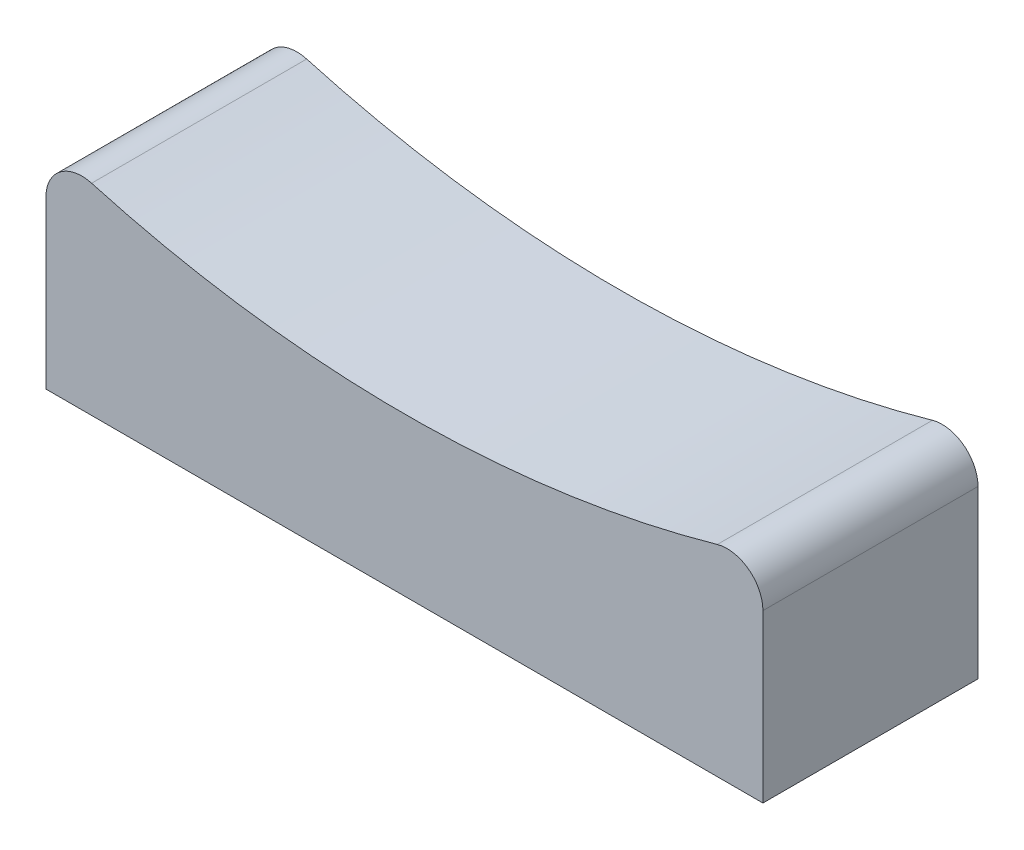
ISO-10303-21;
HEADER;
FILE_DESCRIPTION(('STEP AP214'),'2;1');
FILE_NAME('part.step','',(''),(''),'','','');
FILE_SCHEMA(('AUTOMOTIVE_DESIGN { 1 0 10303 214 1 1 1 1 }'));
ENDSEC;
DATA;
#1=APPLICATION_CONTEXT('core data for automotive mechanical design processes');
#2=APPLICATION_PROTOCOL_DEFINITION('international standard','automotive_design',2000,#1);
#3=PRODUCT_CONTEXT('',#1,'mechanical');
#4=PRODUCT('Part','Part','',(#3));
#5=PRODUCT_RELATED_PRODUCT_CATEGORY('part','',(#4));
#6=PRODUCT_DEFINITION_FORMATION('','',#4);
#7=PRODUCT_DEFINITION_CONTEXT('part definition',#1,'design');
#8=PRODUCT_DEFINITION('design','',#6,#7);
#9=PRODUCT_DEFINITION_SHAPE('','',#8);
#10=(LENGTH_UNIT() NAMED_UNIT(*) SI_UNIT(.MILLI.,.METRE.));
#11=(NAMED_UNIT(*) PLANE_ANGLE_UNIT() SI_UNIT($,.RADIAN.));
#12=(NAMED_UNIT(*) SI_UNIT($,.STERADIAN.) SOLID_ANGLE_UNIT());
#13=UNCERTAINTY_MEASURE_WITH_UNIT(LENGTH_MEASURE(1.E-05),#10,'distance_accuracy_value','');
#14=(GEOMETRIC_REPRESENTATION_CONTEXT(3) GLOBAL_UNCERTAINTY_ASSIGNED_CONTEXT((#13)) GLOBAL_UNIT_ASSIGNED_CONTEXT((#10,
#11,#12)) REPRESENTATION_CONTEXT('',''));
#15=CARTESIAN_POINT('',(0.,0.,0.));
#16=DIRECTION('',(0.,0.,1.));
#17=DIRECTION('',(1.,0.,0.));
#18=AXIS2_PLACEMENT_3D('',#15,#16,#17);
#19=CARTESIAN_POINT('',(50.,20.,-15.));
#20=DIRECTION('',(-1.,0.,0.));
#21=DIRECTION('',(0.,0.,1.));
#22=AXIS2_PLACEMENT_3D('',#19,#20,#21);
#23=PLANE('',#22);
#24=DIRECTION('',(0.,-1.,0.));
#25=VECTOR('',#24,1.);
#26=CARTESIAN_POINT('',(50.,20.,-15.));
#27=LINE('',#26,#25);
#28=CARTESIAN_POINT('',(50.,13.2450865539055,-15.));
#29=VERTEX_POINT('',#28);
#30=CARTESIAN_POINT('',(50.,-10.,-15.));
#31=VERTEX_POINT('',#30);
#32=EDGE_CURVE('E105',#29,#31,#27,.T.);
#33=ORIENTED_EDGE('',*,*,#32,.F.);
#34=DIRECTION('',(0.,0.,1.));
#35=VECTOR('',#34,1.);
#36=CARTESIAN_POINT('',(50.,13.2450865539055,-15.));
#37=LINE('',#36,#35);
#38=CARTESIAN_POINT('',(50.,13.2450865539055,15.));
#39=VERTEX_POINT('',#38);
#40=EDGE_CURVE('E65',#29,#39,#37,.T.);
#41=ORIENTED_EDGE('',*,*,#40,.T.);
#42=DIRECTION('',(0.,-1.,0.));
#43=VECTOR('',#42,1.);
#44=CARTESIAN_POINT('',(50.,20.,15.));
#45=LINE('',#44,#43);
#46=CARTESIAN_POINT('',(50.,-10.,15.));
#47=VERTEX_POINT('',#46);
#48=EDGE_CURVE('E133',#39,#47,#45,.T.);
#49=ORIENTED_EDGE('',*,*,#48,.T.);
#50=DIRECTION('',(0.,0.,1.));
#51=VECTOR('',#50,1.);
#52=CARTESIAN_POINT('',(50.,-10.,15.));
#53=LINE('',#52,#51);
#54=EDGE_CURVE('E115',#31,#47,#53,.T.);
#55=ORIENTED_EDGE('',*,*,#54,.F.);
#56=EDGE_LOOP('',(#33,#41,#49,#55));
#57=FACE_BOUND('',#56,.T.);
#58=ADVANCED_FACE('F41',(#57),#23,.F.);
#59=CARTESIAN_POINT('',(-50.,20.,-15.));
#60=DIRECTION('',(0.,0.,1.));
#61=DIRECTION('',(1.,0.,0.));
#62=AXIS2_PLACEMENT_3D('',#59,#60,#61);
#63=PLANE('',#62);
#64=CARTESIAN_POINT('',(0.,172.25,-15.));
#65=DIRECTION('',(0.,0.,1.));
#66=DIRECTION('',(1.,0.,0.));
#67=AXIS2_PLACEMENT_3D('',#64,#65,#66);
#68=CIRCLE('',#67,160.25);
#69=CARTESIAN_POINT('',(-43.6384266263238,18.0561278079477,-15.));
#70=VERTEX_POINT('',#69);
#71=CARTESIAN_POINT('',(43.6384266263237,18.0561278079477,-15.));
#72=VERTEX_POINT('',#71);
#73=EDGE_CURVE('E131',#70,#72,#68,.T.);
#74=ORIENTED_EDGE('',*,*,#73,.T.);
#75=CARTESIAN_POINT('',(45.,13.2450865539055,-15.));
#76=DIRECTION('',(0.,0.,1.));
#77=DIRECTION('',(1.,0.,0.));
#78=AXIS2_PLACEMENT_3D('',#75,#76,#77);
#79=CIRCLE('',#78,5.);
#80=EDGE_CURVE('E147',#72,#29,#79,.F.);
#81=ORIENTED_EDGE('',*,*,#80,.T.);
#82=ORIENTED_EDGE('',*,*,#32,.T.);
#83=DIRECTION('',(1.,0.,0.));
#84=VECTOR('',#83,1.);
#85=CARTESIAN_POINT('',(-50.,-10.,-15.));
#86=LINE('',#85,#84);
#87=CARTESIAN_POINT('',(-50.,-10.,-15.));
#88=VERTEX_POINT('',#87);
#89=EDGE_CURVE('E109',#88,#31,#86,.T.);
#90=ORIENTED_EDGE('',*,*,#89,.F.);
#91=DIRECTION('',(0.,-1.,0.));
#92=VECTOR('',#91,1.);
#93=CARTESIAN_POINT('',(-50.,20.,-15.));
#94=LINE('',#93,#92);
#95=CARTESIAN_POINT('',(-50.,13.2450865539055,-15.));
#96=VERTEX_POINT('',#95);
#97=EDGE_CURVE('E96',#96,#88,#94,.T.);
#98=ORIENTED_EDGE('',*,*,#97,.F.);
#99=CARTESIAN_POINT('',(-45.,13.2450865539055,-15.));
#100=DIRECTION('',(0.,0.,1.));
#101=DIRECTION('',(1.,0.,0.));
#102=AXIS2_PLACEMENT_3D('',#99,#100,#101);
#103=CIRCLE('',#102,5.);
#104=EDGE_CURVE('E145',#96,#70,#103,.F.);
#105=ORIENTED_EDGE('',*,*,#104,.T.);
#106=EDGE_LOOP('',(#74,#81,#82,#90,#98,#105));
#107=FACE_BOUND('',#106,.T.);
#108=ADVANCED_FACE('F111',(#107),#63,.F.);
#109=CARTESIAN_POINT('',(-50.,20.,-15.));
#110=DIRECTION('',(1.,0.,0.));
#111=DIRECTION('',(0.,0.,-1.));
#112=AXIS2_PLACEMENT_3D('',#109,#110,#111);
#113=PLANE('',#112);
#114=DIRECTION('',(0.,-1.,0.));
#115=VECTOR('',#114,1.);
#116=CARTESIAN_POINT('',(-50.,20.,15.));
#117=LINE('',#116,#115);
#118=CARTESIAN_POINT('',(-50.,13.2450865539055,15.));
#119=VERTEX_POINT('',#118);
#120=CARTESIAN_POINT('',(-50.,-10.,15.));
#121=VERTEX_POINT('',#120);
#122=EDGE_CURVE('E106',#119,#121,#117,.T.);
#123=ORIENTED_EDGE('',*,*,#122,.F.);
#124=DIRECTION('',(0.,0.,1.));
#125=VECTOR('',#124,1.);
#126=CARTESIAN_POINT('',(-50.,13.2450865539055,-15.));
#127=LINE('',#126,#125);
#128=EDGE_CURVE('E102',#119,#96,#127,.F.);
#129=ORIENTED_EDGE('',*,*,#128,.T.);
#130=ORIENTED_EDGE('',*,*,#97,.T.);
#131=DIRECTION('',(0.,0.,-1.));
#132=VECTOR('',#131,1.);
#133=CARTESIAN_POINT('',(-50.,-10.,15.));
#134=LINE('',#133,#132);
#135=EDGE_CURVE('E100',#121,#88,#134,.T.);
#136=ORIENTED_EDGE('',*,*,#135,.F.);
#137=EDGE_LOOP('',(#123,#129,#130,#136));
#138=FACE_BOUND('',#137,.T.);
#139=ADVANCED_FACE('F98',(#138),#113,.F.);
#140=CARTESIAN_POINT('',(-50.,20.,15.));
#141=DIRECTION('',(0.,0.,-1.));
#142=DIRECTION('',(-1.,0.,0.));
#143=AXIS2_PLACEMENT_3D('',#140,#141,#142);
#144=PLANE('',#143);
#145=ORIENTED_EDGE('',*,*,#48,.F.);
#146=CARTESIAN_POINT('',(45.,13.2450865539055,15.));
#147=DIRECTION('',(0.,0.,-1.));
#148=DIRECTION('',(-1.,0.,0.));
#149=AXIS2_PLACEMENT_3D('',#146,#147,#148);
#150=CIRCLE('',#149,5.);
#151=CARTESIAN_POINT('',(43.6384266263237,18.0561278079477,15.));
#152=VERTEX_POINT('',#151);
#153=EDGE_CURVE('E151',#39,#152,#150,.F.);
#154=ORIENTED_EDGE('',*,*,#153,.T.);
#155=CARTESIAN_POINT('',(0.,172.25,15.));
#156=DIRECTION('',(0.,0.,1.));
#157=DIRECTION('',(1.,0.,0.));
#158=AXIS2_PLACEMENT_3D('',#155,#156,#157);
#159=CIRCLE('',#158,160.25);
#160=CARTESIAN_POINT('',(-43.6384266263238,18.0561278079477,15.));
#161=VERTEX_POINT('',#160);
#162=EDGE_CURVE('E130',#161,#152,#159,.T.);
#163=ORIENTED_EDGE('',*,*,#162,.F.);
#164=CARTESIAN_POINT('',(-45.,13.2450865539055,15.));
#165=DIRECTION('',(0.,0.,-1.));
#166=DIRECTION('',(-1.,0.,0.));
#167=AXIS2_PLACEMENT_3D('',#164,#165,#166);
#168=CIRCLE('',#167,5.);
#169=EDGE_CURVE('E57',#161,#119,#168,.F.);
#170=ORIENTED_EDGE('',*,*,#169,.T.);
#171=ORIENTED_EDGE('',*,*,#122,.T.);
#172=DIRECTION('',(-1.,0.,0.));
#173=VECTOR('',#172,1.);
#174=CARTESIAN_POINT('',(-50.,-10.,15.));
#175=LINE('',#174,#173);
#176=EDGE_CURVE('E120',#47,#121,#175,.T.);
#177=ORIENTED_EDGE('',*,*,#176,.F.);
#178=EDGE_LOOP('',(#145,#154,#163,#170,#171,#177));
#179=FACE_BOUND('',#178,.T.);
#180=ADVANCED_FACE('F195',(#179),#144,.F.);
#181=CARTESIAN_POINT('',(0.,172.25,-15.));
#182=DIRECTION('',(0.,0.,1.));
#183=DIRECTION('',(1.,0.,0.));
#184=AXIS2_PLACEMENT_3D('',#181,#182,#183);
#185=CYLINDRICAL_SURFACE('',#184,160.25);
#186=ORIENTED_EDGE('',*,*,#162,.T.);
#187=DIRECTION('',(0.,0.,1.));
#188=VECTOR('',#187,1.);
#189=CARTESIAN_POINT('',(43.6384266263237,18.0561278079477,-15.));
#190=LINE('',#189,#188);
#191=EDGE_CURVE('E142',#152,#72,#190,.F.);
#192=ORIENTED_EDGE('',*,*,#191,.T.);
#193=ORIENTED_EDGE('',*,*,#73,.F.);
#194=DIRECTION('',(0.,0.,1.));
#195=VECTOR('',#194,1.);
#196=CARTESIAN_POINT('',(-43.6384266263238,18.0561278079477,-15.));
#197=LINE('',#196,#195);
#198=EDGE_CURVE('E139',#70,#161,#197,.T.);
#199=ORIENTED_EDGE('',*,*,#198,.T.);
#200=EDGE_LOOP('',(#186,#192,#193,#199));
#201=FACE_BOUND('',#200,.T.);
#202=ADVANCED_FACE('F182',(#201),#185,.F.);
#203=CARTESIAN_POINT('',(45.,13.2450865539055,-15.));
#204=DIRECTION('',(0.,0.,1.));
#205=DIRECTION('',(1.,0.,0.));
#206=AXIS2_PLACEMENT_3D('',#203,#204,#205);
#207=CYLINDRICAL_SURFACE('',#206,5.);
#208=ORIENTED_EDGE('',*,*,#153,.F.);
#209=ORIENTED_EDGE('',*,*,#40,.F.);
#210=ORIENTED_EDGE('',*,*,#80,.F.);
#211=ORIENTED_EDGE('',*,*,#191,.F.);
#212=EDGE_LOOP('',(#208,#209,#210,#211));
#213=FACE_BOUND('',#212,.T.);
#214=ADVANCED_FACE('F179',(#213),#207,.T.);
#215=CARTESIAN_POINT('',(-45.,13.2450865539055,-15.));
#216=DIRECTION('',(0.,0.,1.));
#217=DIRECTION('',(1.,0.,0.));
#218=AXIS2_PLACEMENT_3D('',#215,#216,#217);
#219=CYLINDRICAL_SURFACE('',#218,5.);
#220=ORIENTED_EDGE('',*,*,#104,.F.);
#221=ORIENTED_EDGE('',*,*,#128,.F.);
#222=ORIENTED_EDGE('',*,*,#169,.F.);
#223=ORIENTED_EDGE('',*,*,#198,.F.);
#224=EDGE_LOOP('',(#220,#221,#222,#223));
#225=FACE_BOUND('',#224,.T.);
#226=ADVANCED_FACE('F181',(#225),#219,.T.);
#227=CARTESIAN_POINT('',(0.,-10.,0.));
#228=DIRECTION('',(0.,-1.,0.));
#229=DIRECTION('',(0.,0.,-1.));
#230=AXIS2_PLACEMENT_3D('',#227,#228,#229);
#231=PLANE('',#230);
#232=CARTESIAN_POINT('',(0.,-10.,0.));
#233=DIRECTION('',(0.,-1.,0.));
#234=DIRECTION('',(0.,0.,-1.));
#235=AXIS2_PLACEMENT_3D('',#232,#233,#234);
#236=CIRCLE('',#235,7.00000000000001);
#237=CARTESIAN_POINT('',(0.,-10.,-7.00000000000001));
#238=VERTEX_POINT('',#237);
#239=EDGE_CURVE('E11',#238,#238,#236,.F.);
#240=ORIENTED_EDGE('',*,*,#239,.T.);
#241=EDGE_LOOP('',(#240));
#242=FACE_BOUND('',#241,.T.);
#243=ORIENTED_EDGE('',*,*,#135,.T.);
#244=ORIENTED_EDGE('',*,*,#89,.T.);
#245=ORIENTED_EDGE('',*,*,#54,.T.);
#246=ORIENTED_EDGE('',*,*,#176,.T.);
#247=EDGE_LOOP('',(#243,#244,#245,#246));
#248=FACE_BOUND('',#247,.T.);
#249=ADVANCED_FACE('F118',(#242,#248),#231,.T.);
#250=CARTESIAN_POINT('',(0.,-5.,0.));
#251=DIRECTION('',(0.,-1.,0.));
#252=DIRECTION('',(0.,0.,-1.));
#253=AXIS2_PLACEMENT_3D('',#250,#251,#252);
#254=CYLINDRICAL_SURFACE('',#253,6.);
#255=CARTESIAN_POINT('',(0.,-9.,0.));
#256=DIRECTION('',(0.,-1.,0.));
#257=DIRECTION('',(0.,0.,-1.));
#258=AXIS2_PLACEMENT_3D('',#255,#256,#257);
#259=CIRCLE('',#258,6.);
#260=CARTESIAN_POINT('',(0.,-9.,-6.));
#261=VERTEX_POINT('',#260);
#262=EDGE_CURVE('E50',#261,#261,#259,.T.);
#263=ORIENTED_EDGE('',*,*,#262,.T.);
#264=EDGE_LOOP('',(#263));
#265=FACE_BOUND('',#264,.T.);
#266=CARTESIAN_POINT('',(0.,-5.,0.));
#267=DIRECTION('',(0.,-1.,0.));
#268=DIRECTION('',(0.,0.,-1.));
#269=AXIS2_PLACEMENT_3D('',#266,#267,#268);
#270=CIRCLE('',#269,6.);
#271=CARTESIAN_POINT('',(0.,-5.,-6.));
#272=VERTEX_POINT('',#271);
#273=EDGE_CURVE('E121',#272,#272,#270,.T.);
#274=ORIENTED_EDGE('',*,*,#273,.F.);
#275=EDGE_LOOP('',(#274));
#276=FACE_BOUND('',#275,.T.);
#277=ADVANCED_FACE('F156',(#265,#276),#254,.F.);
#278=CARTESIAN_POINT('',(0.,-0.25,0.));
#279=DIRECTION('',(0.,-1.,0.));
#280=DIRECTION('',(0.,0.,-1.));
#281=AXIS2_PLACEMENT_3D('',#278,#279,#280);
#282=CYLINDRICAL_SURFACE('',#281,7.5);
#283=CARTESIAN_POINT('',(0.,-0.25,0.));
#284=DIRECTION('',(0.,-1.,0.));
#285=DIRECTION('',(0.,0.,-1.));
#286=AXIS2_PLACEMENT_3D('',#283,#284,#285);
#287=CIRCLE('',#286,7.5);
#288=CARTESIAN_POINT('',(0.,-0.25,-7.5));
#289=VERTEX_POINT('',#288);
#290=EDGE_CURVE('E124',#289,#289,#287,.T.);
#291=ORIENTED_EDGE('',*,*,#290,.F.);
#292=EDGE_LOOP('',(#291));
#293=FACE_BOUND('',#292,.T.);
#294=CARTESIAN_POINT('',(0.,-5.,0.));
#295=DIRECTION('',(0.,-1.,0.));
#296=DIRECTION('',(0.,0.,-1.));
#297=AXIS2_PLACEMENT_3D('',#294,#295,#296);
#298=CIRCLE('',#297,7.5);
#299=CARTESIAN_POINT('',(0.,-5.,-7.5));
#300=VERTEX_POINT('',#299);
#301=EDGE_CURVE('E215',#300,#300,#298,.T.);
#302=ORIENTED_EDGE('',*,*,#301,.T.);
#303=EDGE_LOOP('',(#302));
#304=FACE_BOUND('',#303,.T.);
#305=ADVANCED_FACE('F206',(#293,#304),#282,.F.);
#306=CARTESIAN_POINT('',(0.,-0.25,0.));
#307=DIRECTION('',(0.,-1.,0.));
#308=DIRECTION('',(0.,0.,-1.));
#309=AXIS2_PLACEMENT_3D('',#306,#307,#308);
#310=PLANE('',#309);
#311=ORIENTED_EDGE('',*,*,#290,.T.);
#312=EDGE_LOOP('',(#311));
#313=FACE_BOUND('',#312,.T.);
#314=ADVANCED_FACE('F166',(#313),#310,.T.);
#315=CARTESIAN_POINT('',(0.,-5.,0.));
#316=DIRECTION('',(0.,-1.,0.));
#317=DIRECTION('',(0.,0.,-1.));
#318=AXIS2_PLACEMENT_3D('',#315,#316,#317);
#319=PLANE('',#318);
#320=ORIENTED_EDGE('',*,*,#273,.T.);
#321=EDGE_LOOP('',(#320));
#322=FACE_BOUND('',#321,.T.);
#323=ORIENTED_EDGE('',*,*,#301,.F.);
#324=EDGE_LOOP('',(#323));
#325=FACE_BOUND('',#324,.T.);
#326=ADVANCED_FACE('F160',(#322,#325),#319,.F.);
#327=CARTESIAN_POINT('',(0.,-9.,0.));
#328=DIRECTION('',(0.,-1.,0.));
#329=DIRECTION('',(0.,0.,-1.));
#330=AXIS2_PLACEMENT_3D('',#327,#328,#329);
#331=CONICAL_SURFACE('',#330,6.,0.785398163397452);
#332=ORIENTED_EDGE('',*,*,#239,.F.);
#333=EDGE_LOOP('',(#332));
#334=FACE_BOUND('',#333,.T.);
#335=ORIENTED_EDGE('',*,*,#262,.F.);
#336=EDGE_LOOP('',(#335));
#337=FACE_BOUND('',#336,.T.);
#338=ADVANCED_FACE('F44',(#334,#337),#331,.F.);
#339=CLOSED_SHELL('',(#58,#108,#139,#180,#202,#214,#226,#249,#277,#305,#314,#326,#338));
#340=MANIFOLD_SOLID_BREP('B2',#339);
#341=ADVANCED_BREP_SHAPE_REPRESENTATION('',(#18,#340),#14);
#342=SHAPE_DEFINITION_REPRESENTATION(#9,#341);
ENDSEC;
END-ISO-10303-21;
